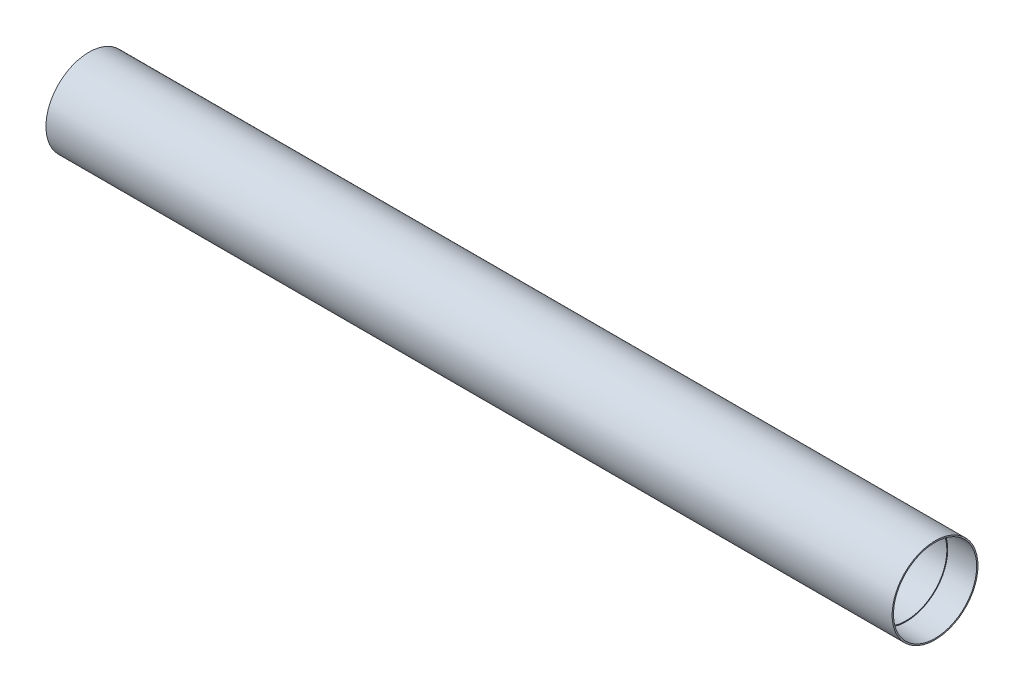
ISO-10303-21;
HEADER;
FILE_DESCRIPTION(('STEP AP214'),'2;1');
FILE_NAME('part.step','',(''),(''),'','','');
FILE_SCHEMA(('AUTOMOTIVE_DESIGN { 1 0 10303 214 1 1 1 1 }'));
ENDSEC;
DATA;
#1=APPLICATION_CONTEXT('core data for automotive mechanical design processes');
#2=APPLICATION_PROTOCOL_DEFINITION('international standard','automotive_design',2000,#1);
#3=PRODUCT_CONTEXT('',#1,'mechanical');
#4=PRODUCT('Part','Part','',(#3));
#5=PRODUCT_RELATED_PRODUCT_CATEGORY('part','',(#4));
#6=PRODUCT_DEFINITION_FORMATION('','',#4);
#7=PRODUCT_DEFINITION_CONTEXT('part definition',#1,'design');
#8=PRODUCT_DEFINITION('design','',#6,#7);
#9=PRODUCT_DEFINITION_SHAPE('','',#8);
#10=(LENGTH_UNIT() NAMED_UNIT(*) SI_UNIT(.MILLI.,.METRE.));
#11=(NAMED_UNIT(*) PLANE_ANGLE_UNIT() SI_UNIT($,.RADIAN.));
#12=(NAMED_UNIT(*) SI_UNIT($,.STERADIAN.) SOLID_ANGLE_UNIT());
#13=UNCERTAINTY_MEASURE_WITH_UNIT(LENGTH_MEASURE(1.E-05),#10,'distance_accuracy_value','');
#14=(GEOMETRIC_REPRESENTATION_CONTEXT(3) GLOBAL_UNCERTAINTY_ASSIGNED_CONTEXT((#13)) GLOBAL_UNIT_ASSIGNED_CONTEXT((#10,
#11,#12)) REPRESENTATION_CONTEXT('',''));
#15=CARTESIAN_POINT('',(0.,0.,0.));
#16=DIRECTION('',(0.,0.,1.));
#17=DIRECTION('',(1.,0.,0.));
#18=AXIS2_PLACEMENT_3D('',#15,#16,#17);
#19=CARTESIAN_POINT('',(742.3404,0.,0.));
#20=DIRECTION('',(-1.,0.,0.));
#21=DIRECTION('',(0.,0.,1.));
#22=AXIS2_PLACEMENT_3D('',#19,#20,#21);
#23=CYLINDRICAL_SURFACE('',#22,37.6555);
#24=CARTESIAN_POINT('',(742.3404,0.,0.));
#25=DIRECTION('',(1.,0.,0.));
#26=DIRECTION('',(0.,0.,-1.));
#27=AXIS2_PLACEMENT_3D('',#24,#25,#26);
#28=CIRCLE('',#27,37.6555);
#29=CARTESIAN_POINT('',(742.3404,0.,-37.6555));
#30=VERTEX_POINT('',#29);
#31=EDGE_CURVE('E10',#30,#30,#28,.T.);
#32=ORIENTED_EDGE('',*,*,#31,.F.);
#33=EDGE_LOOP('',(#32));
#34=FACE_BOUND('',#33,.T.);
#35=CARTESIAN_POINT('',(0.,0.,0.));
#36=DIRECTION('',(1.,0.,0.));
#37=DIRECTION('',(0.,0.,-1.));
#38=AXIS2_PLACEMENT_3D('',#35,#36,#37);
#39=CIRCLE('',#38,37.6555);
#40=CARTESIAN_POINT('',(0.,0.,-37.6555));
#41=VERTEX_POINT('',#40);
#42=EDGE_CURVE('E50',#41,#41,#39,.T.);
#43=ORIENTED_EDGE('',*,*,#42,.T.);
#44=EDGE_LOOP('',(#43));
#45=FACE_BOUND('',#44,.T.);
#46=ADVANCED_FACE('F42',(#34,#45),#23,.T.);
#47=CARTESIAN_POINT('',(742.3404,0.,0.));
#48=DIRECTION('',(1.,0.,0.));
#49=DIRECTION('',(0.,0.,-1.));
#50=AXIS2_PLACEMENT_3D('',#47,#48,#49);
#51=PLANE('',#50);
#52=CARTESIAN_POINT('',(742.3404,0.,0.));
#53=DIRECTION('',(1.,0.,0.));
#54=DIRECTION('',(0.,0.,-1.));
#55=AXIS2_PLACEMENT_3D('',#52,#53,#54);
#56=CIRCLE('',#55,36.5);
#57=CARTESIAN_POINT('',(742.3404,0.,-36.5));
#58=VERTEX_POINT('',#57);
#59=EDGE_CURVE('E58',#58,#58,#56,.T.);
#60=ORIENTED_EDGE('',*,*,#59,.F.);
#61=EDGE_LOOP('',(#60));
#62=FACE_BOUND('',#61,.T.);
#63=ORIENTED_EDGE('',*,*,#31,.T.);
#64=EDGE_LOOP('',(#63));
#65=FACE_BOUND('',#64,.T.);
#66=ADVANCED_FACE('F101',(#62,#65),#51,.T.);
#67=CARTESIAN_POINT('',(0.,0.,0.));
#68=DIRECTION('',(1.,0.,0.));
#69=DIRECTION('',(0.,0.,-1.));
#70=AXIS2_PLACEMENT_3D('',#67,#68,#69);
#71=PLANE('',#70);
#72=CARTESIAN_POINT('',(0.,0.,0.));
#73=DIRECTION('',(-1.,0.,0.));
#74=DIRECTION('',(0.,0.,1.));
#75=AXIS2_PLACEMENT_3D('',#72,#73,#74);
#76=CIRCLE('',#75,36.5);
#77=CARTESIAN_POINT('',(0.,0.,36.5));
#78=VERTEX_POINT('',#77);
#79=EDGE_CURVE('E66',#78,#78,#76,.T.);
#80=ORIENTED_EDGE('',*,*,#79,.F.);
#81=EDGE_LOOP('',(#80));
#82=FACE_BOUND('',#81,.T.);
#83=ORIENTED_EDGE('',*,*,#42,.F.);
#84=EDGE_LOOP('',(#83));
#85=FACE_BOUND('',#84,.T.);
#86=ADVANCED_FACE('F97',(#82,#85),#71,.F.);
#87=CARTESIAN_POINT('',(716.9404,0.,0.));
#88=DIRECTION('',(1.,0.,0.));
#89=DIRECTION('',(0.,0.,-1.));
#90=AXIS2_PLACEMENT_3D('',#87,#88,#89);
#91=CYLINDRICAL_SURFACE('',#90,36.5);
#92=CARTESIAN_POINT('',(716.9404,0.,0.));
#93=DIRECTION('',(1.,0.,0.));
#94=DIRECTION('',(0.,0.,-1.));
#95=AXIS2_PLACEMENT_3D('',#92,#93,#94);
#96=CIRCLE('',#95,36.5);
#97=CARTESIAN_POINT('',(716.9404,0.,-36.5));
#98=VERTEX_POINT('',#97);
#99=EDGE_CURVE('E56',#98,#98,#96,.T.);
#100=ORIENTED_EDGE('',*,*,#99,.F.);
#101=EDGE_LOOP('',(#100));
#102=FACE_BOUND('',#101,.T.);
#103=ORIENTED_EDGE('',*,*,#59,.T.);
#104=EDGE_LOOP('',(#103));
#105=FACE_BOUND('',#104,.T.);
#106=ADVANCED_FACE('F100',(#102,#105),#91,.F.);
#107=CARTESIAN_POINT('',(716.9404,0.,0.));
#108=DIRECTION('',(1.,0.,0.));
#109=DIRECTION('',(0.,0.,-1.));
#110=AXIS2_PLACEMENT_3D('',#107,#108,#109);
#111=PLANE('',#110);
#112=CARTESIAN_POINT('',(716.9404,0.,0.));
#113=DIRECTION('',(1.,0.,0.));
#114=DIRECTION('',(0.,0.,-1.));
#115=AXIS2_PLACEMENT_3D('',#112,#113,#114);
#116=CIRCLE('',#115,35.75);
#117=CARTESIAN_POINT('',(716.9404,0.,-35.75));
#118=VERTEX_POINT('',#117);
#119=EDGE_CURVE('E73',#118,#118,#116,.T.);
#120=ORIENTED_EDGE('',*,*,#119,.F.);
#121=EDGE_LOOP('',(#120));
#122=FACE_BOUND('',#121,.T.);
#123=ORIENTED_EDGE('',*,*,#99,.T.);
#124=EDGE_LOOP('',(#123));
#125=FACE_BOUND('',#124,.T.);
#126=ADVANCED_FACE('F93',(#122,#125),#111,.T.);
#127=CARTESIAN_POINT('',(25.4,0.,0.));
#128=DIRECTION('',(-1.,0.,0.));
#129=DIRECTION('',(0.,0.,1.));
#130=AXIS2_PLACEMENT_3D('',#127,#128,#129);
#131=CYLINDRICAL_SURFACE('',#130,36.5);
#132=CARTESIAN_POINT('',(25.4,0.,0.));
#133=DIRECTION('',(-1.,0.,0.));
#134=DIRECTION('',(0.,0.,1.));
#135=AXIS2_PLACEMENT_3D('',#132,#133,#134);
#136=CIRCLE('',#135,36.5);
#137=CARTESIAN_POINT('',(25.4,0.,36.5));
#138=VERTEX_POINT('',#137);
#139=EDGE_CURVE('E62',#138,#138,#136,.T.);
#140=ORIENTED_EDGE('',*,*,#139,.F.);
#141=EDGE_LOOP('',(#140));
#142=FACE_BOUND('',#141,.T.);
#143=ORIENTED_EDGE('',*,*,#79,.T.);
#144=EDGE_LOOP('',(#143));
#145=FACE_BOUND('',#144,.T.);
#146=ADVANCED_FACE('F87',(#142,#145),#131,.F.);
#147=CARTESIAN_POINT('',(25.4,0.,0.));
#148=DIRECTION('',(-1.,0.,0.));
#149=DIRECTION('',(0.,0.,1.));
#150=AXIS2_PLACEMENT_3D('',#147,#148,#149);
#151=PLANE('',#150);
#152=CARTESIAN_POINT('',(25.4,0.,0.));
#153=DIRECTION('',(-1.,0.,0.));
#154=DIRECTION('',(0.,0.,1.));
#155=AXIS2_PLACEMENT_3D('',#152,#153,#154);
#156=CIRCLE('',#155,35.75);
#157=CARTESIAN_POINT('',(25.4,0.,-35.75));
#158=VERTEX_POINT('',#157);
#159=EDGE_CURVE('E45',#158,#158,#156,.T.);
#160=ORIENTED_EDGE('',*,*,#159,.F.);
#161=EDGE_LOOP('',(#160));
#162=FACE_BOUND('',#161,.T.);
#163=ORIENTED_EDGE('',*,*,#139,.T.);
#164=EDGE_LOOP('',(#163));
#165=FACE_BOUND('',#164,.T.);
#166=ADVANCED_FACE('F84',(#162,#165),#151,.T.);
#167=CARTESIAN_POINT('',(0.,0.,0.));
#168=DIRECTION('',(1.,0.,0.));
#169=DIRECTION('',(0.,0.,-1.));
#170=AXIS2_PLACEMENT_3D('',#167,#168,#169);
#171=CYLINDRICAL_SURFACE('',#170,35.75);
#172=CARTESIAN_POINT('',(25.4,0.,-35.75));
#173=CARTESIAN_POINT('',(32.6035458333333,0.,-35.75));
#174=CARTESIAN_POINT('',(39.8070916666667,0.,-35.75));
#175=CARTESIAN_POINT('',(54.2141833333333,0.,-35.75));
#176=CARTESIAN_POINT('',(61.4177291666667,0.,-35.75));
#177=CARTESIAN_POINT('',(75.8248208333333,0.,-35.75));
#178=CARTESIAN_POINT('',(83.0283666666667,0.,-35.75));
#179=CARTESIAN_POINT('',(97.4354583333333,0.,-35.75));
#180=CARTESIAN_POINT('',(104.639004166667,0.,-35.75));
#181=CARTESIAN_POINT('',(119.046095833333,0.,-35.75));
#182=CARTESIAN_POINT('',(126.249641666667,0.,-35.75));
#183=CARTESIAN_POINT('',(140.656733333333,0.,-35.75));
#184=CARTESIAN_POINT('',(147.860279166667,0.,-35.75));
#185=CARTESIAN_POINT('',(162.267370833333,0.,-35.75));
#186=CARTESIAN_POINT('',(169.470916666667,0.,-35.75));
#187=CARTESIAN_POINT('',(183.878008333333,0.,-35.75));
#188=CARTESIAN_POINT('',(191.081554166667,0.,-35.75));
#189=CARTESIAN_POINT('',(205.488645833333,0.,-35.75));
#190=CARTESIAN_POINT('',(212.692191666667,0.,-35.75));
#191=CARTESIAN_POINT('',(227.099283333333,0.,-35.75));
#192=CARTESIAN_POINT('',(234.302829166667,0.,-35.75));
#193=CARTESIAN_POINT('',(248.709920833333,0.,-35.75));
#194=CARTESIAN_POINT('',(255.913466666667,0.,-35.75));
#195=CARTESIAN_POINT('',(270.320558333333,0.,-35.75));
#196=CARTESIAN_POINT('',(277.524104166667,0.,-35.75));
#197=CARTESIAN_POINT('',(291.931195833333,0.,-35.75));
#198=CARTESIAN_POINT('',(299.134741666667,0.,-35.75));
#199=CARTESIAN_POINT('',(313.541833333333,0.,-35.75));
#200=CARTESIAN_POINT('',(320.745379166667,0.,-35.75));
#201=CARTESIAN_POINT('',(335.152470833333,0.,-35.75));
#202=CARTESIAN_POINT('',(342.356016666667,0.,-35.75));
#203=CARTESIAN_POINT('',(356.763108333333,0.,-35.75));
#204=CARTESIAN_POINT('',(363.966654166667,0.,-35.75));
#205=CARTESIAN_POINT('',(378.373745833333,0.,-35.75));
#206=CARTESIAN_POINT('',(385.577291666667,0.,-35.75));
#207=CARTESIAN_POINT('',(399.984383333333,0.,-35.75));
#208=CARTESIAN_POINT('',(407.187929166667,0.,-35.75));
#209=CARTESIAN_POINT('',(421.595020833333,0.,-35.75));
#210=CARTESIAN_POINT('',(428.798566666667,0.,-35.75));
#211=CARTESIAN_POINT('',(443.205658333333,0.,-35.75));
#212=CARTESIAN_POINT('',(450.409204166667,0.,-35.75));
#213=CARTESIAN_POINT('',(464.816295833333,0.,-35.75));
#214=CARTESIAN_POINT('',(472.019841666667,0.,-35.75));
#215=CARTESIAN_POINT('',(486.426933333333,0.,-35.75));
#216=CARTESIAN_POINT('',(493.630479166667,0.,-35.75));
#217=CARTESIAN_POINT('',(508.037570833333,0.,-35.75));
#218=CARTESIAN_POINT('',(515.241116666666,0.,-35.75));
#219=CARTESIAN_POINT('',(529.648208333333,0.,-35.75));
#220=CARTESIAN_POINT('',(536.851754166667,0.,-35.75));
#221=CARTESIAN_POINT('',(551.258845833333,0.,-35.75));
#222=CARTESIAN_POINT('',(558.462391666666,0.,-35.75));
#223=CARTESIAN_POINT('',(572.869483333333,0.,-35.75));
#224=CARTESIAN_POINT('',(580.073029166667,0.,-35.75));
#225=CARTESIAN_POINT('',(594.480120833333,0.,-35.75));
#226=CARTESIAN_POINT('',(601.683666666666,0.,-35.75));
#227=CARTESIAN_POINT('',(616.090758333333,0.,-35.75));
#228=CARTESIAN_POINT('',(623.294304166666,0.,-35.75));
#229=CARTESIAN_POINT('',(637.701395833333,0.,-35.75));
#230=CARTESIAN_POINT('',(644.904941666666,0.,-35.75));
#231=CARTESIAN_POINT('',(659.312033333333,0.,-35.75));
#232=CARTESIAN_POINT('',(666.515579166666,0.,-35.75));
#233=CARTESIAN_POINT('',(680.922670833333,0.,-35.75));
#234=CARTESIAN_POINT('',(688.126216666667,0.,-35.75));
#235=CARTESIAN_POINT('',(702.533308333333,0.,-35.75));
#236=CARTESIAN_POINT('',(709.736854166666,0.,-35.75));
#237=CARTESIAN_POINT('',(716.9404,0.,-35.75));
#238=B_SPLINE_CURVE_WITH_KNOTS('',3,(#172,#173,#174,#175,#176,#177,#178,#179,#180,#181,#182,
#183,#184,#185,#186,#187,#188,#189,#190,#191,#192,#193,#194,#195,#196,#197,#198,#199,#200,#201,
#202,#203,#204,#205,#206,#207,#208,#209,#210,#211,#212,#213,#214,#215,#216,#217,#218,#219,#220,
#221,#222,#223,#224,#225,#226,#227,#228,#229,#230,#231,#232,#233,#234,#235,#236,#237),
.UNSPECIFIED.,.F.,.F.,(4,2,2,2,2,2,2,2,2,2,2,2,2,2,2,2,2,2,2,2,2,2,2,2,2,2,2,2,2,2,2,2,4),(0.,
21.6106375,43.221275,64.8319125,86.44255,108.0531875,129.663825,151.2744625,172.8851,
194.4957375,216.106375,237.7170125,259.32765,280.9382875,302.548925,324.1595625,345.7702,
367.3808375,388.991475,410.6021125,432.21275,453.8233875,475.434025,497.0446625,518.6553,
540.2659375,561.876575,583.4872125,605.09785,626.7084875,648.319125,669.9297625,691.5404),.UNSPECIFIED.);
#239=EDGE_CURVE('BSEAM82',#158,#118,#238,.T.);
#240=ORIENTED_EDGE('',*,*,#159,.T.);
#241=ORIENTED_EDGE('',*,*,#119,.T.);
#242=ORIENTED_EDGE('',*,*,#239,.T.);
#243=ORIENTED_EDGE('',*,*,#239,.F.);
#244=EDGE_LOOP('',(#240,#242,#241,#243));
#245=FACE_BOUND('',#244,.T.);
#246=ADVANCED_FACE('F82',(#245),#171,.F.);
#247=CLOSED_SHELL('',(#46,#66,#86,#106,#126,#146,#166,#246));
#248=MANIFOLD_SOLID_BREP('B2',#247);
#249=ADVANCED_BREP_SHAPE_REPRESENTATION('',(#18,#248),#14);
#250=SHAPE_DEFINITION_REPRESENTATION(#9,#249);
ENDSEC;
END-ISO-10303-21;
